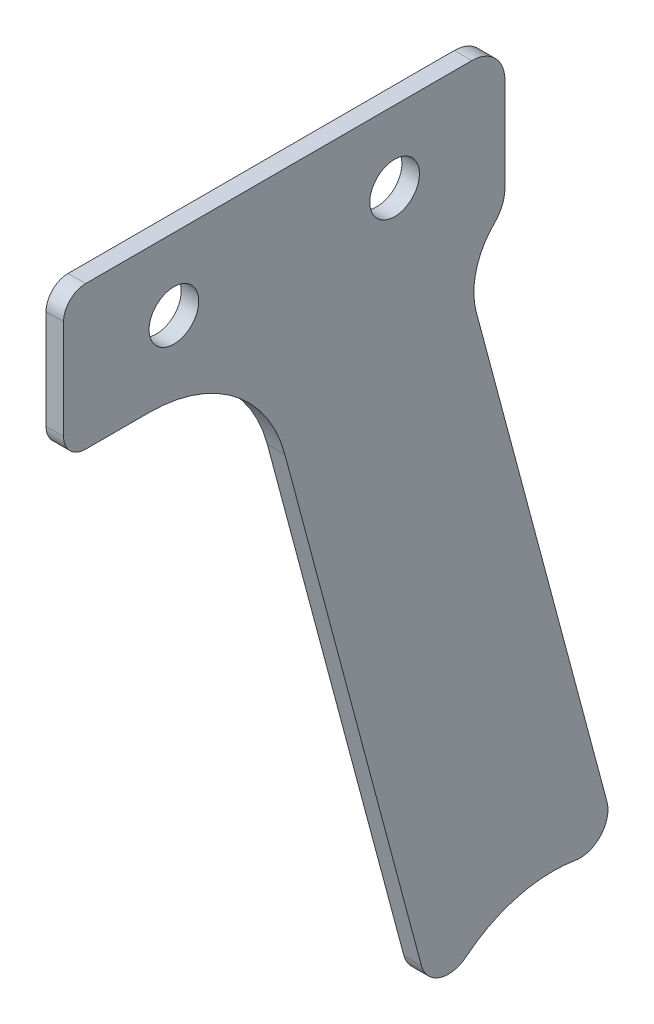
ISO-10303-21;
HEADER;
FILE_DESCRIPTION(('STEP AP214'),'2;1');
FILE_NAME('part.step','',(''),(''),'','','');
FILE_SCHEMA(('AUTOMOTIVE_DESIGN { 1 0 10303 214 1 1 1 1 }'));
ENDSEC;
DATA;
#1=APPLICATION_CONTEXT('core data for automotive mechanical design processes');
#2=APPLICATION_PROTOCOL_DEFINITION('international standard','automotive_design',2000,#1);
#3=PRODUCT_CONTEXT('',#1,'mechanical');
#4=PRODUCT('Part','Part','',(#3));
#5=PRODUCT_RELATED_PRODUCT_CATEGORY('part','',(#4));
#6=PRODUCT_DEFINITION_FORMATION('','',#4);
#7=PRODUCT_DEFINITION_CONTEXT('part definition',#1,'design');
#8=PRODUCT_DEFINITION('design','',#6,#7);
#9=PRODUCT_DEFINITION_SHAPE('','',#8);
#10=(LENGTH_UNIT() NAMED_UNIT(*) SI_UNIT(.MILLI.,.METRE.));
#11=(NAMED_UNIT(*) PLANE_ANGLE_UNIT() SI_UNIT($,.RADIAN.));
#12=(NAMED_UNIT(*) SI_UNIT($,.STERADIAN.) SOLID_ANGLE_UNIT());
#13=UNCERTAINTY_MEASURE_WITH_UNIT(LENGTH_MEASURE(1.E-05),#10,'distance_accuracy_value','');
#14=(GEOMETRIC_REPRESENTATION_CONTEXT(3) GLOBAL_UNCERTAINTY_ASSIGNED_CONTEXT((#13)) GLOBAL_UNIT_ASSIGNED_CONTEXT((#10,
#11,#12)) REPRESENTATION_CONTEXT('',''));
#15=CARTESIAN_POINT('',(0.,0.,0.));
#16=DIRECTION('',(0.,0.,1.));
#17=DIRECTION('',(1.,0.,0.));
#18=AXIS2_PLACEMENT_3D('',#15,#16,#17);
#19=CARTESIAN_POINT('',(-1.5875,247.591344708746,-926.969880761367));
#20=DIRECTION('',(0.,0.258051243760172,-0.966131231041533));
#21=DIRECTION('',(0.,0.966131231041533,0.258051243760172));
#22=AXIS2_PLACEMENT_3D('',#19,#20,#21);
#23=PLANE('',#22);
#24=DIRECTION('',(0.,0.966131231041533,0.258051243760172));
#25=VECTOR('',#24,1.);
#26=CARTESIAN_POINT('',(0.,247.591344708746,-926.969880761367));
#27=LINE('',#26,#25);
#28=CARTESIAN_POINT('',(0.,488.370245552131,-862.658436479766));
#29=VERTEX_POINT('',#28);
#30=CARTESIAN_POINT('',(0.,534.709690567615,-850.281286215706));
#31=VERTEX_POINT('',#30);
#32=EDGE_CURVE('E180',#29,#31,#27,.T.);
#33=ORIENTED_EDGE('',*,*,#32,.T.);
#34=DIRECTION('',(1.,0.,0.));
#35=VECTOR('',#34,1.);
#36=CARTESIAN_POINT('',(-1.5875,534.709690567615,-850.281286215706));
#37=LINE('',#36,#35);
#38=CARTESIAN_POINT('',(-1.5875,534.709690567615,-850.281286215706));
#39=VERTEX_POINT('',#38);
#40=EDGE_CURVE('E252',#31,#39,#37,.F.);
#41=ORIENTED_EDGE('',*,*,#40,.T.);
#42=DIRECTION('',(0.,0.966131231041533,0.258051243760172));
#43=VECTOR('',#42,1.);
#44=CARTESIAN_POINT('',(-1.5875,247.591344708746,-926.969880761367));
#45=LINE('',#44,#43);
#46=CARTESIAN_POINT('',(-1.5875,488.370245552131,-862.658436479766));
#47=VERTEX_POINT('',#46);
#48=EDGE_CURVE('E198',#47,#39,#45,.T.);
#49=ORIENTED_EDGE('',*,*,#48,.F.);
#50=DIRECTION('',(-1.,0.,0.));
#51=VECTOR('',#50,1.);
#52=CARTESIAN_POINT('',(0.,488.370245552131,-862.658436479766));
#53=LINE('',#52,#51);
#54=EDGE_CURVE('E239',#47,#29,#53,.F.);
#55=ORIENTED_EDGE('',*,*,#54,.T.);
#56=EDGE_LOOP('',(#33,#41,#49,#55));
#57=FACE_BOUND('',#56,.T.);
#58=ADVANCED_FACE('F41',(#57),#23,.F.);
#59=CARTESIAN_POINT('',(-1.5875,544.132439771861,0.));
#60=DIRECTION('',(0.,-1.,0.));
#61=DIRECTION('',(0.,0.,-1.));
#62=AXIS2_PLACEMENT_3D('',#59,#60,#61);
#63=PLANE('',#62);
#64=DIRECTION('',(0.,0.,-1.));
#65=VECTOR('',#64,1.);
#66=CARTESIAN_POINT('',(-1.5875,544.132439771861,0.));
#67=LINE('',#66,#65);
#68=CARTESIAN_POINT('',(-1.5875,544.132439771861,-832.226267654692));
#69=VERTEX_POINT('',#68);
#70=CARTESIAN_POINT('',(-1.5875,544.132439771861,-838.011419581479));
#71=VERTEX_POINT('',#70);
#72=EDGE_CURVE('E161',#69,#71,#67,.T.);
#73=ORIENTED_EDGE('',*,*,#72,.T.);
#74=DIRECTION('',(1.,0.,0.));
#75=VECTOR('',#74,1.);
#76=CARTESIAN_POINT('',(-1.5875,544.132439771861,-838.011419581479));
#77=LINE('',#76,#75);
#78=CARTESIAN_POINT('',(0.,544.132439771861,-838.011419581479));
#79=VERTEX_POINT('',#78);
#80=EDGE_CURVE('E249',#71,#79,#77,.T.);
#81=ORIENTED_EDGE('',*,*,#80,.T.);
#82=DIRECTION('',(0.,0.,-1.));
#83=VECTOR('',#82,1.);
#84=CARTESIAN_POINT('',(0.,544.132439771861,0.));
#85=LINE('',#84,#83);
#86=CARTESIAN_POINT('',(0.,544.132439771861,-832.226267654692));
#87=VERTEX_POINT('',#86);
#88=EDGE_CURVE('E195',#87,#79,#85,.T.);
#89=ORIENTED_EDGE('',*,*,#88,.F.);
#90=DIRECTION('',(1.,0.,0.));
#91=VECTOR('',#90,1.);
#92=CARTESIAN_POINT('',(-1.5875,544.132439771861,-832.226267654692));
#93=LINE('',#92,#91);
#94=EDGE_CURVE('E213',#69,#87,#93,.T.);
#95=ORIENTED_EDGE('',*,*,#94,.F.);
#96=EDGE_LOOP('',(#73,#81,#89,#95));
#97=FACE_BOUND('',#96,.T.);
#98=ADVANCED_FACE('F286',(#97),#63,.T.);
#99=CARTESIAN_POINT('',(-1.5875,546.132439771861,-832.226267654692));
#100=DIRECTION('',(1.,0.,0.));
#101=DIRECTION('',(0.,0.,-1.));
#102=AXIS2_PLACEMENT_3D('',#99,#100,#101);
#103=CYLINDRICAL_SURFACE('',#102,2.);
#104=CARTESIAN_POINT('',(0.,546.132439771861,-832.226267654692));
#105=DIRECTION('',(1.,0.,0.));
#106=DIRECTION('',(0.,0.,-1.));
#107=AXIS2_PLACEMENT_3D('',#104,#105,#106);
#108=CIRCLE('',#107,2.);
#109=CARTESIAN_POINT('',(0.,546.132439771861,-830.226267654692));
#110=VERTEX_POINT('',#109);
#111=EDGE_CURVE('E199',#110,#87,#108,.T.);
#112=ORIENTED_EDGE('',*,*,#111,.F.);
#113=DIRECTION('',(1.,0.,0.));
#114=VECTOR('',#113,1.);
#115=CARTESIAN_POINT('',(-1.5875,546.132439771861,-830.226267654692));
#116=LINE('',#115,#114);
#117=CARTESIAN_POINT('',(-1.5875,546.132439771861,-830.226267654692));
#118=VERTEX_POINT('',#117);
#119=EDGE_CURVE('E216',#118,#110,#116,.T.);
#120=ORIENTED_EDGE('',*,*,#119,.F.);
#121=CARTESIAN_POINT('',(-1.5875,546.132439771861,-832.226267654692));
#122=DIRECTION('',(1.,0.,0.));
#123=DIRECTION('',(0.,0.,-1.));
#124=AXIS2_PLACEMENT_3D('',#121,#122,#123);
#125=CIRCLE('',#124,2.);
#126=EDGE_CURVE('E177',#118,#69,#125,.T.);
#127=ORIENTED_EDGE('',*,*,#126,.T.);
#128=ORIENTED_EDGE('',*,*,#94,.T.);
#129=EDGE_LOOP('',(#112,#120,#127,#128));
#130=FACE_BOUND('',#129,.T.);
#131=ADVANCED_FACE('F346',(#130),#103,.T.);
#132=CARTESIAN_POINT('',(-1.5875,0.,-830.226267654692));
#133=DIRECTION('',(0.,0.,-1.));
#134=DIRECTION('',(-1.,0.,0.));
#135=AXIS2_PLACEMENT_3D('',#132,#133,#134);
#136=PLANE('',#135);
#137=DIRECTION('',(0.,1.,0.));
#138=VECTOR('',#137,1.);
#139=CARTESIAN_POINT('',(0.,0.,-830.226267654692));
#140=LINE('',#139,#138);
#141=CARTESIAN_POINT('',(0.,555.132439771861,-830.226267654692));
#142=VERTEX_POINT('',#141);
#143=EDGE_CURVE('E208',#110,#142,#140,.T.);
#144=ORIENTED_EDGE('',*,*,#143,.T.);
#145=DIRECTION('',(1.,0.,0.));
#146=VECTOR('',#145,1.);
#147=CARTESIAN_POINT('',(-1.5875,555.132439771861,-830.226267654692));
#148=LINE('',#147,#146);
#149=CARTESIAN_POINT('',(-1.5875,555.132439771861,-830.226267654692));
#150=VERTEX_POINT('',#149);
#151=EDGE_CURVE('E218',#150,#142,#148,.T.);
#152=ORIENTED_EDGE('',*,*,#151,.F.);
#153=DIRECTION('',(0.,1.,0.));
#154=VECTOR('',#153,1.);
#155=CARTESIAN_POINT('',(-1.5875,0.,-830.226267654692));
#156=LINE('',#155,#154);
#157=EDGE_CURVE('E175',#118,#150,#156,.T.);
#158=ORIENTED_EDGE('',*,*,#157,.F.);
#159=ORIENTED_EDGE('',*,*,#119,.T.);
#160=EDGE_LOOP('',(#144,#152,#158,#159));
#161=FACE_BOUND('',#160,.T.);
#162=ADVANCED_FACE('F471',(#161),#136,.F.);
#163=CARTESIAN_POINT('',(-1.5875,555.132439771861,-832.226267654692));
#164=DIRECTION('',(1.,0.,0.));
#165=DIRECTION('',(0.,0.,-1.));
#166=AXIS2_PLACEMENT_3D('',#163,#164,#165);
#167=CYLINDRICAL_SURFACE('',#166,2.);
#168=CARTESIAN_POINT('',(0.,555.132439771861,-832.226267654692));
#169=DIRECTION('',(1.,0.,0.));
#170=DIRECTION('',(0.,0.,-1.));
#171=AXIS2_PLACEMENT_3D('',#168,#169,#170);
#172=CIRCLE('',#171,2.);
#173=CARTESIAN_POINT('',(0.,557.132439771861,-832.226267654692));
#174=VERTEX_POINT('',#173);
#175=EDGE_CURVE('E205',#174,#142,#172,.T.);
#176=ORIENTED_EDGE('',*,*,#175,.F.);
#177=DIRECTION('',(1.,0.,0.));
#178=VECTOR('',#177,1.);
#179=CARTESIAN_POINT('',(-1.5875,557.132439771861,-832.226267654692));
#180=LINE('',#179,#178);
#181=CARTESIAN_POINT('',(-1.5875,557.132439771861,-832.226267654692));
#182=VERTEX_POINT('',#181);
#183=EDGE_CURVE('E220',#182,#174,#180,.T.);
#184=ORIENTED_EDGE('',*,*,#183,.F.);
#185=CARTESIAN_POINT('',(-1.5875,555.132439771861,-832.226267654692));
#186=DIRECTION('',(1.,0.,0.));
#187=DIRECTION('',(0.,0.,-1.));
#188=AXIS2_PLACEMENT_3D('',#185,#186,#187);
#189=CIRCLE('',#188,2.);
#190=EDGE_CURVE('E169',#182,#150,#189,.T.);
#191=ORIENTED_EDGE('',*,*,#190,.T.);
#192=ORIENTED_EDGE('',*,*,#151,.T.);
#193=EDGE_LOOP('',(#176,#184,#191,#192));
#194=FACE_BOUND('',#193,.T.);
#195=ADVANCED_FACE('F461',(#194),#167,.T.);
#196=CARTESIAN_POINT('',(-1.5875,557.132439771861,0.));
#197=DIRECTION('',(0.,-1.,0.));
#198=DIRECTION('',(0.,0.,-1.));
#199=AXIS2_PLACEMENT_3D('',#196,#197,#198);
#200=PLANE('',#199);
#201=DIRECTION('',(0.,0.,-1.));
#202=VECTOR('',#201,1.);
#203=CARTESIAN_POINT('',(0.,557.132439771861,0.));
#204=LINE('',#203,#202);
#205=CARTESIAN_POINT('',(0.,557.132439771861,-867.226267654692));
#206=VERTEX_POINT('',#205);
#207=EDGE_CURVE('E202',#174,#206,#204,.T.);
#208=ORIENTED_EDGE('',*,*,#207,.T.);
#209=DIRECTION('',(1.,0.,0.));
#210=VECTOR('',#209,1.);
#211=CARTESIAN_POINT('',(-1.5875,557.132439771861,-867.226267654692));
#212=LINE('',#211,#210);
#213=CARTESIAN_POINT('',(-1.5875,557.132439771861,-867.226267654692));
#214=VERTEX_POINT('',#213);
#215=EDGE_CURVE('E160',#214,#206,#212,.T.);
#216=ORIENTED_EDGE('',*,*,#215,.F.);
#217=DIRECTION('',(0.,0.,-1.));
#218=VECTOR('',#217,1.);
#219=CARTESIAN_POINT('',(-1.5875,557.132439771861,0.));
#220=LINE('',#219,#218);
#221=EDGE_CURVE('E166',#182,#214,#220,.T.);
#222=ORIENTED_EDGE('',*,*,#221,.F.);
#223=ORIENTED_EDGE('',*,*,#183,.T.);
#224=EDGE_LOOP('',(#208,#216,#222,#223));
#225=FACE_BOUND('',#224,.T.);
#226=ADVANCED_FACE('F452',(#225),#200,.F.);
#227=CARTESIAN_POINT('',(-1.5875,554.132439771861,-867.226267654692));
#228=DIRECTION('',(1.,0.,0.));
#229=DIRECTION('',(0.,0.,-1.));
#230=AXIS2_PLACEMENT_3D('',#227,#228,#229);
#231=CYLINDRICAL_SURFACE('',#230,3.);
#232=CARTESIAN_POINT('',(0.,554.132439771861,-867.226267654692));
#233=DIRECTION('',(1.,0.,0.));
#234=DIRECTION('',(0.,0.,-1.));
#235=AXIS2_PLACEMENT_3D('',#232,#233,#234);
#236=CIRCLE('',#235,3.);
#237=CARTESIAN_POINT('',(0.,554.132439771861,-870.226267654692));
#238=VERTEX_POINT('',#237);
#239=EDGE_CURVE('E159',#238,#206,#236,.T.);
#240=ORIENTED_EDGE('',*,*,#239,.F.);
#241=DIRECTION('',(1.,0.,0.));
#242=VECTOR('',#241,1.);
#243=CARTESIAN_POINT('',(-1.5875,554.132439771861,-870.226267654692));
#244=LINE('',#243,#242);
#245=CARTESIAN_POINT('',(-1.5875,554.132439771861,-870.226267654692));
#246=VERTEX_POINT('',#245);
#247=EDGE_CURVE('E147',#246,#238,#244,.T.);
#248=ORIENTED_EDGE('',*,*,#247,.F.);
#249=CARTESIAN_POINT('',(-1.5875,554.132439771861,-867.226267654692));
#250=DIRECTION('',(1.,0.,0.));
#251=DIRECTION('',(0.,0.,-1.));
#252=AXIS2_PLACEMENT_3D('',#249,#250,#251);
#253=CIRCLE('',#252,3.);
#254=EDGE_CURVE('E152',#246,#214,#253,.T.);
#255=ORIENTED_EDGE('',*,*,#254,.T.);
#256=ORIENTED_EDGE('',*,*,#215,.T.);
#257=EDGE_LOOP('',(#240,#248,#255,#256));
#258=FACE_BOUND('',#257,.T.);
#259=ADVANCED_FACE('F157',(#258),#231,.T.);
#260=CARTESIAN_POINT('',(-1.5875,9.66145238983859E-12,-870.226267654698));
#261=DIRECTION('',(0.,0.,-1.));
#262=DIRECTION('',(0.,1.,0.));
#263=AXIS2_PLACEMENT_3D('',#260,#261,#262);
#264=PLANE('',#263);
#265=DIRECTION('',(0.,1.,0.));
#266=VECTOR('',#265,1.);
#267=CARTESIAN_POINT('',(0.,9.66145238983859E-12,-870.226267654698));
#268=LINE('',#267,#266);
#269=CARTESIAN_POINT('',(0.,545.61844813898,-870.226267654692));
#270=VERTEX_POINT('',#269);
#271=EDGE_CURVE('E194',#270,#238,#268,.T.);
#272=ORIENTED_EDGE('',*,*,#271,.F.);
#273=DIRECTION('',(-1.,0.,0.));
#274=VECTOR('',#273,1.);
#275=CARTESIAN_POINT('',(-1.5875,545.61844813898,-870.226267654692));
#276=LINE('',#275,#274);
#277=CARTESIAN_POINT('',(-1.5875,545.61844813898,-870.226267654692));
#278=VERTEX_POINT('',#277);
#279=EDGE_CURVE('E49',#270,#278,#276,.T.);
#280=ORIENTED_EDGE('',*,*,#279,.T.);
#281=DIRECTION('',(0.,1.,0.));
#282=VECTOR('',#281,1.);
#283=CARTESIAN_POINT('',(-1.5875,9.66145238983859E-12,-870.226267654698));
#284=LINE('',#283,#282);
#285=EDGE_CURVE('E144',#278,#246,#284,.T.);
#286=ORIENTED_EDGE('',*,*,#285,.T.);
#287=ORIENTED_EDGE('',*,*,#247,.T.);
#288=EDGE_LOOP('',(#272,#280,#286,#287));
#289=FACE_BOUND('',#288,.T.);
#290=ADVANCED_FACE('F146',(#289),#264,.T.);
#291=CARTESIAN_POINT('',(-1.5875,252.082031136414,-943.782791032079));
#292=DIRECTION('',(0.,-0.258051243760172,0.966131231041533));
#293=DIRECTION('',(0.,-0.966131231041533,-0.258051243760171));
#294=AXIS2_PLACEMENT_3D('',#291,#292,#293);
#295=PLANE('',#294);
#296=DIRECTION('',(0.,-0.966131231041533,-0.258051243760172));
#297=VECTOR('',#296,1.);
#298=CARTESIAN_POINT('',(-1.5875,252.082031136414,-943.782791032079));
#299=LINE('',#298,#297);
#300=CARTESIAN_POINT('',(-1.5875,537.217132969926,-867.623916022419));
#301=VERTEX_POINT('',#300);
#302=CARTESIAN_POINT('',(-1.5875,492.831430693317,-879.479226470565));
#303=VERTEX_POINT('',#302);
#304=EDGE_CURVE('E153',#301,#303,#299,.T.);
#305=ORIENTED_EDGE('',*,*,#304,.F.);
#306=DIRECTION('',(1.,0.,0.));
#307=VECTOR('',#306,1.);
#308=CARTESIAN_POINT('',(-1.5875,537.217132969926,-867.623916022419));
#309=LINE('',#308,#307);
#310=CARTESIAN_POINT('',(0.,537.217132969926,-867.623916022419));
#311=VERTEX_POINT('',#310);
#312=EDGE_CURVE('E242',#301,#311,#309,.T.);
#313=ORIENTED_EDGE('',*,*,#312,.T.);
#314=DIRECTION('',(0.,-0.966131231041533,-0.258051243760172));
#315=VECTOR('',#314,1.);
#316=CARTESIAN_POINT('',(0.,252.082031136414,-943.782791032079));
#317=LINE('',#316,#315);
#318=CARTESIAN_POINT('',(0.,492.831430693317,-879.479226470565));
#319=VERTEX_POINT('',#318);
#320=EDGE_CURVE('E189',#311,#319,#317,.T.);
#321=ORIENTED_EDGE('',*,*,#320,.T.);
#322=DIRECTION('',(-1.,0.,0.));
#323=VECTOR('',#322,1.);
#324=CARTESIAN_POINT('',(-1.5875,492.831430693317,-879.479226470565));
#325=LINE('',#324,#323);
#326=EDGE_CURVE('E232',#319,#303,#325,.T.);
#327=ORIENTED_EDGE('',*,*,#326,.T.);
#328=EDGE_LOOP('',(#305,#313,#321,#327));
#329=FACE_BOUND('',#328,.T.);
#330=ADVANCED_FACE('F272',(#329),#295,.F.);
#331=CARTESIAN_POINT('',(-1.5875,489.202974707188,-870.624756009542));
#332=CARTESIAN_POINT('',(-1.5875,497.235159963985,-894.721311780076));
#333=CARTESIAN_POINT('',(-1.5875,472.552405882785,-902.948896473761));
#334=CARTESIAN_POINT('',(-1.5875,464.520220625987,-878.852340703227));
#335=CARTESIAN_POINT('',(-1.5875,456.488035369189,-854.755784932694));
#336=CARTESIAN_POINT('',(-1.5875,481.17078945039,-846.528200239009));
#337=CARTESIAN_POINT('',(-1.5875,489.202974707188,-870.624756009542));
#338=(BOUNDED_CURVE() B_SPLINE_CURVE(3,(#331,#332,#333,#334,#335,#336,#337),.UNSPECIFIED.,.T.,
.F.) B_SPLINE_CURVE_WITH_KNOTS((4,3,4),(0.,0.5,1.),
.UNSPECIFIED.) CURVE() GEOMETRIC_REPRESENTATION_ITEM() RATIONAL_B_SPLINE_CURVE((1.,
0.333333333333333,0.333333333333333,1.,0.333333333333333,0.333333333333333,1.)) REPRESENTATION_ITEM(''));
#339=DIRECTION('',(1.,0.,0.));
#340=VECTOR('',#339,1.);
#341=SURFACE_OF_LINEAR_EXTRUSION('',#338,#340);
#342=CARTESIAN_POINT('',(-1.5875,487.054636708806,-866.714448011136));
#343=VERTEX_POINT('',#342);
#344=CARTESIAN_POINT('',(-1.5875,489.670311539135,-876.609052606315));
#345=VERTEX_POINT('',#344);
#346=EDGE_CURVE('E274',#343,#345,#338,.T.);
#347=ORIENTED_EDGE('',*,*,#346,.T.);
#348=DIRECTION('',(1.,0.,0.));
#349=VECTOR('',#348,1.);
#350=CARTESIAN_POINT('',(-1.5875,489.670311539135,-876.609052606315));
#351=LINE('',#350,#349);
#352=CARTESIAN_POINT('',(0.,489.670311539135,-876.609052606315));
#353=VERTEX_POINT('',#352);
#354=EDGE_CURVE('E224',#345,#353,#351,.T.);
#355=ORIENTED_EDGE('',*,*,#354,.T.);
#356=CARTESIAN_POINT('',(0.,489.202974707188,-870.624756009542));
#357=CARTESIAN_POINT('',(0.,497.235159963985,-894.721311780076));
#358=CARTESIAN_POINT('',(0.,472.552405882785,-902.948896473761));
#359=CARTESIAN_POINT('',(0.,464.520220625987,-878.852340703227));
#360=CARTESIAN_POINT('',(0.,456.488035369189,-854.755784932694));
#361=CARTESIAN_POINT('',(0.,481.17078945039,-846.528200239009));
#362=CARTESIAN_POINT('',(0.,489.202974707188,-870.624756009542));
#363=(BOUNDED_CURVE() B_SPLINE_CURVE(3,(#356,#357,#358,#359,#360,#361,#362),.UNSPECIFIED.,.T.,
.F.) B_SPLINE_CURVE_WITH_KNOTS((4,3,4),(0.,0.5,1.),
.UNSPECIFIED.) CURVE() GEOMETRIC_REPRESENTATION_ITEM() RATIONAL_B_SPLINE_CURVE((1.,
0.333333333333333,0.333333333333333,1.,0.333333333333333,0.333333333333333,1.)) REPRESENTATION_ITEM(''));
#364=CARTESIAN_POINT('',(0.,487.054636708806,-866.714448011136));
#365=VERTEX_POINT('',#364);
#366=EDGE_CURVE('E183',#365,#353,#363,.T.);
#367=ORIENTED_EDGE('',*,*,#366,.F.);
#368=DIRECTION('',(1.,0.,0.));
#369=VECTOR('',#368,1.);
#370=CARTESIAN_POINT('',(0.,487.054636708805,-866.714448011135));
#371=LINE('',#370,#369);
#372=EDGE_CURVE('E215',#365,#343,#371,.F.);
#373=ORIENTED_EDGE('',*,*,#372,.T.);
#374=EDGE_LOOP('',(#347,#355,#367,#373));
#375=FACE_BOUND('',#374,.T.);
#376=ADVANCED_FACE('F304',(#375),#341,.T.);
#377=CARTESIAN_POINT('',(-1.5875,0.,0.));
#378=DIRECTION('',(1.,0.,0.));
#379=DIRECTION('',(0.,0.,-1.));
#380=AXIS2_PLACEMENT_3D('',#377,#378,#379);
#381=PLANE('',#380);
#382=CARTESIAN_POINT('',(-1.5875,550.632439771863,-860.22626765469));
#383=DIRECTION('',(-1.,0.,0.));
#384=DIRECTION('',(0.,0.,1.));
#385=AXIS2_PLACEMENT_3D('',#382,#383,#384);
#386=CIRCLE('',#385,2.24999999999997);
#387=CARTESIAN_POINT('',(-1.5875,550.632439771863,-857.97626765469));
#388=VERTEX_POINT('',#387);
#389=EDGE_CURVE('E318',#388,#388,#386,.T.);
#390=ORIENTED_EDGE('',*,*,#389,.F.);
#391=EDGE_LOOP('',(#390));
#392=FACE_BOUND('',#391,.T.);
#393=CARTESIAN_POINT('',(-1.5875,550.632439771863,-840.22626765469));
#394=DIRECTION('',(-1.,0.,0.));
#395=DIRECTION('',(0.,0.,1.));
#396=AXIS2_PLACEMENT_3D('',#393,#394,#395);
#397=CIRCLE('',#396,2.24999999999997);
#398=CARTESIAN_POINT('',(-1.5875,550.632439771863,-837.97626765469));
#399=VERTEX_POINT('',#398);
#400=EDGE_CURVE('E312',#399,#399,#397,.T.);
#401=ORIENTED_EDGE('',*,*,#400,.F.);
#402=EDGE_LOOP('',(#401));
#403=FACE_BOUND('',#402,.T.);
#404=ORIENTED_EDGE('',*,*,#285,.F.);
#405=CARTESIAN_POINT('',(-1.5875,545.61844813898,-867.051267654692));
#406=DIRECTION('',(1.,0.,0.));
#407=DIRECTION('',(0.,0.,-1.));
#408=AXIS2_PLACEMENT_3D('',#405,#406,#407);
#409=CIRCLE('',#408,3.175);
#410=CARTESIAN_POINT('',(-1.5875,543.364218215255,-869.287128216305));
#411=VERTEX_POINT('',#410);
#412=EDGE_CURVE('E11',#278,#411,#409,.F.);
#413=ORIENTED_EDGE('',*,*,#412,.T.);
#414=CARTESIAN_POINT('',(-1.5875,538.855758367803,-873.758849339533));
#415=DIRECTION('',(1.,0.,0.));
#416=DIRECTION('',(0.,0.,-1.));
#417=AXIS2_PLACEMENT_3D('',#414,#415,#416);
#418=CIRCLE('',#417,6.35);
#419=EDGE_CURVE('E247',#411,#301,#418,.T.);
#420=ORIENTED_EDGE('',*,*,#419,.T.);
#421=ORIENTED_EDGE('',*,*,#304,.T.);
#422=CARTESIAN_POINT('',(-1.5875,492.175980534166,-877.02525314372));
#423=DIRECTION('',(1.,0.,0.));
#424=DIRECTION('',(0.,0.,-1.));
#425=AXIS2_PLACEMENT_3D('',#422,#423,#424);
#426=CIRCLE('',#425,2.54);
#427=EDGE_CURVE('E237',#303,#345,#426,.F.);
#428=ORIENTED_EDGE('',*,*,#427,.T.);
#429=ORIENTED_EDGE('',*,*,#346,.F.);
#430=CARTESIAN_POINT('',(-1.5875,489.025695711282,-865.112409806611));
#431=DIRECTION('',(1.,0.,0.));
#432=DIRECTION('',(0.,0.,-1.));
#433=AXIS2_PLACEMENT_3D('',#430,#431,#432);
#434=CIRCLE('',#433,2.54);
#435=EDGE_CURVE('E235',#343,#47,#434,.F.);
#436=ORIENTED_EDGE('',*,*,#435,.T.);
#437=ORIENTED_EDGE('',*,*,#48,.T.);
#438=CARTESIAN_POINT('',(-1.5875,531.43243977186,-838.011419581479));
#439=DIRECTION('',(1.,0.,0.));
#440=DIRECTION('',(0.,0.,-1.));
#441=AXIS2_PLACEMENT_3D('',#438,#439,#440);
#442=CIRCLE('',#441,12.7);
#443=EDGE_CURVE('E256',#39,#71,#442,.T.);
#444=ORIENTED_EDGE('',*,*,#443,.T.);
#445=ORIENTED_EDGE('',*,*,#72,.F.);
#446=ORIENTED_EDGE('',*,*,#126,.F.);
#447=ORIENTED_EDGE('',*,*,#157,.T.);
#448=ORIENTED_EDGE('',*,*,#190,.F.);
#449=ORIENTED_EDGE('',*,*,#221,.T.);
#450=ORIENTED_EDGE('',*,*,#254,.F.);
#451=EDGE_LOOP('',(#404,#413,#420,#421,#428,#429,#436,#437,#444,#445,#446,#447,#448,#449,#450));
#452=FACE_BOUND('',#451,.T.);
#453=ADVANCED_FACE('F163',(#392,#403,#452),#381,.F.);
#454=CARTESIAN_POINT('',(0.,0.,0.));
#455=DIRECTION('',(1.,0.,0.));
#456=DIRECTION('',(0.,0.,-1.));
#457=AXIS2_PLACEMENT_3D('',#454,#455,#456);
#458=PLANE('',#457);
#459=CARTESIAN_POINT('',(0.,550.632439771863,-860.22626765469));
#460=DIRECTION('',(-1.,0.,0.));
#461=DIRECTION('',(0.,0.,1.));
#462=AXIS2_PLACEMENT_3D('',#459,#460,#461);
#463=CIRCLE('',#462,2.24999999999997);
#464=CARTESIAN_POINT('',(0.,550.632439771863,-857.97626765469));
#465=VERTEX_POINT('',#464);
#466=EDGE_CURVE('E315',#465,#465,#463,.T.);
#467=ORIENTED_EDGE('',*,*,#466,.T.);
#468=EDGE_LOOP('',(#467));
#469=FACE_BOUND('',#468,.T.);
#470=CARTESIAN_POINT('',(0.,550.632439771863,-840.22626765469));
#471=DIRECTION('',(-1.,0.,0.));
#472=DIRECTION('',(0.,0.,1.));
#473=AXIS2_PLACEMENT_3D('',#470,#471,#472);
#474=CIRCLE('',#473,2.24999999999997);
#475=CARTESIAN_POINT('',(0.,550.632439771863,-837.97626765469));
#476=VERTEX_POINT('',#475);
#477=EDGE_CURVE('E184',#476,#476,#474,.T.);
#478=ORIENTED_EDGE('',*,*,#477,.T.);
#479=EDGE_LOOP('',(#478));
#480=FACE_BOUND('',#479,.T.);
#481=CARTESIAN_POINT('',(0.,538.855758367803,-873.758849339533));
#482=DIRECTION('',(1.,0.,0.));
#483=DIRECTION('',(0.,0.,-1.));
#484=AXIS2_PLACEMENT_3D('',#481,#482,#483);
#485=CIRCLE('',#484,6.35);
#486=CARTESIAN_POINT('',(0.,543.364218215255,-869.287128216305));
#487=VERTEX_POINT('',#486);
#488=EDGE_CURVE('E245',#311,#487,#485,.F.);
#489=ORIENTED_EDGE('',*,*,#488,.T.);
#490=CARTESIAN_POINT('',(0.,545.61844813898,-867.051267654692));
#491=DIRECTION('',(1.,0.,0.));
#492=DIRECTION('',(0.,0.,-1.));
#493=AXIS2_PLACEMENT_3D('',#490,#491,#492);
#494=CIRCLE('',#493,3.175);
#495=EDGE_CURVE('E63',#487,#270,#494,.T.);
#496=ORIENTED_EDGE('',*,*,#495,.T.);
#497=ORIENTED_EDGE('',*,*,#271,.T.);
#498=ORIENTED_EDGE('',*,*,#239,.T.);
#499=ORIENTED_EDGE('',*,*,#207,.F.);
#500=ORIENTED_EDGE('',*,*,#175,.T.);
#501=ORIENTED_EDGE('',*,*,#143,.F.);
#502=ORIENTED_EDGE('',*,*,#111,.T.);
#503=ORIENTED_EDGE('',*,*,#88,.T.);
#504=CARTESIAN_POINT('',(0.,531.43243977186,-838.011419581479));
#505=DIRECTION('',(1.,0.,0.));
#506=DIRECTION('',(0.,0.,-1.));
#507=AXIS2_PLACEMENT_3D('',#504,#505,#506);
#508=CIRCLE('',#507,12.7);
#509=EDGE_CURVE('E254',#79,#31,#508,.F.);
#510=ORIENTED_EDGE('',*,*,#509,.T.);
#511=ORIENTED_EDGE('',*,*,#32,.F.);
#512=CARTESIAN_POINT('',(0.,489.025695711282,-865.112409806611));
#513=DIRECTION('',(1.,0.,0.));
#514=DIRECTION('',(0.,0.,-1.));
#515=AXIS2_PLACEMENT_3D('',#512,#513,#514);
#516=CIRCLE('',#515,2.54);
#517=EDGE_CURVE('E227',#29,#365,#516,.T.);
#518=ORIENTED_EDGE('',*,*,#517,.T.);
#519=ORIENTED_EDGE('',*,*,#366,.T.);
#520=CARTESIAN_POINT('',(0.,492.175980534166,-877.02525314372));
#521=DIRECTION('',(1.,0.,0.));
#522=DIRECTION('',(0.,0.,-1.));
#523=AXIS2_PLACEMENT_3D('',#520,#521,#522);
#524=CIRCLE('',#523,2.54);
#525=EDGE_CURVE('E229',#353,#319,#524,.T.);
#526=ORIENTED_EDGE('',*,*,#525,.T.);
#527=ORIENTED_EDGE('',*,*,#320,.F.);
#528=EDGE_LOOP('',(#489,#496,#497,#498,#499,#500,#501,#502,#503,#510,#511,#518,#519,#526,#527));
#529=FACE_BOUND('',#528,.T.);
#530=ADVANCED_FACE('F268',(#469,#480,#529),#458,.T.);
#531=CARTESIAN_POINT('',(-0.79375,492.175980534166,-877.02525314372));
#532=DIRECTION('',(1.,0.,0.));
#533=DIRECTION('',(0.,0.,-1.));
#534=AXIS2_PLACEMENT_3D('',#531,#532,#533);
#535=CYLINDRICAL_SURFACE('',#534,2.54);
#536=ORIENTED_EDGE('',*,*,#427,.F.);
#537=ORIENTED_EDGE('',*,*,#326,.F.);
#538=ORIENTED_EDGE('',*,*,#525,.F.);
#539=ORIENTED_EDGE('',*,*,#354,.F.);
#540=EDGE_LOOP('',(#536,#537,#538,#539));
#541=FACE_BOUND('',#540,.T.);
#542=ADVANCED_FACE('F308',(#541),#535,.T.);
#543=CARTESIAN_POINT('',(-0.79375,489.025695711282,-865.112409806611));
#544=DIRECTION('',(1.,0.,0.));
#545=DIRECTION('',(0.,0.,-1.));
#546=AXIS2_PLACEMENT_3D('',#543,#544,#545);
#547=CYLINDRICAL_SURFACE('',#546,2.54);
#548=ORIENTED_EDGE('',*,*,#435,.F.);
#549=ORIENTED_EDGE('',*,*,#372,.F.);
#550=ORIENTED_EDGE('',*,*,#517,.F.);
#551=ORIENTED_EDGE('',*,*,#54,.F.);
#552=EDGE_LOOP('',(#548,#549,#550,#551));
#553=FACE_BOUND('',#552,.T.);
#554=ADVANCED_FACE('F300',(#553),#547,.T.);
#555=CARTESIAN_POINT('',(-1.5875,550.632439771863,-840.22626765469));
#556=DIRECTION('',(-1.,0.,0.));
#557=DIRECTION('',(0.,0.,1.));
#558=AXIS2_PLACEMENT_3D('',#555,#556,#557);
#559=CYLINDRICAL_SURFACE('',#558,2.24999999999997);
#560=ORIENTED_EDGE('',*,*,#477,.F.);
#561=EDGE_LOOP('',(#560));
#562=FACE_BOUND('',#561,.T.);
#563=ORIENTED_EDGE('',*,*,#400,.T.);
#564=EDGE_LOOP('',(#563));
#565=FACE_BOUND('',#564,.T.);
#566=ADVANCED_FACE('F329',(#562,#565),#559,.F.);
#567=CARTESIAN_POINT('',(-1.5875,550.632439771863,-860.22626765469));
#568=DIRECTION('',(-1.,0.,0.));
#569=DIRECTION('',(0.,0.,1.));
#570=AXIS2_PLACEMENT_3D('',#567,#568,#569);
#571=CYLINDRICAL_SURFACE('',#570,2.24999999999997);
#572=ORIENTED_EDGE('',*,*,#466,.F.);
#573=EDGE_LOOP('',(#572));
#574=FACE_BOUND('',#573,.T.);
#575=ORIENTED_EDGE('',*,*,#389,.T.);
#576=EDGE_LOOP('',(#575));
#577=FACE_BOUND('',#576,.T.);
#578=ADVANCED_FACE('F322',(#574,#577),#571,.F.);
#579=CARTESIAN_POINT('',(-1.5875,538.855758367803,-873.758849339533));
#580=DIRECTION('',(1.,0.,0.));
#581=DIRECTION('',(0.,0.,-1.));
#582=AXIS2_PLACEMENT_3D('',#579,#580,#581);
#583=CYLINDRICAL_SURFACE('',#582,6.35);
#584=ORIENTED_EDGE('',*,*,#419,.F.);
#585=DIRECTION('',(1.,0.,0.));
#586=VECTOR('',#585,1.);
#587=CARTESIAN_POINT('',(-1.5875,543.364218215255,-869.287128216305));
#588=LINE('',#587,#586);
#589=EDGE_CURVE('E258',#411,#487,#588,.T.);
#590=ORIENTED_EDGE('',*,*,#589,.T.);
#591=ORIENTED_EDGE('',*,*,#488,.F.);
#592=ORIENTED_EDGE('',*,*,#312,.F.);
#593=EDGE_LOOP('',(#584,#590,#591,#592));
#594=FACE_BOUND('',#593,.T.);
#595=ADVANCED_FACE('F264',(#594),#583,.F.);
#596=CARTESIAN_POINT('',(-1.5875,531.43243977186,-838.011419581479));
#597=DIRECTION('',(1.,0.,0.));
#598=DIRECTION('',(0.,0.,-1.));
#599=AXIS2_PLACEMENT_3D('',#596,#597,#598);
#600=CYLINDRICAL_SURFACE('',#599,12.7);
#601=ORIENTED_EDGE('',*,*,#443,.F.);
#602=ORIENTED_EDGE('',*,*,#40,.F.);
#603=ORIENTED_EDGE('',*,*,#509,.F.);
#604=ORIENTED_EDGE('',*,*,#80,.F.);
#605=EDGE_LOOP('',(#601,#602,#603,#604));
#606=FACE_BOUND('',#605,.T.);
#607=ADVANCED_FACE('F291',(#606),#600,.F.);
#608=CARTESIAN_POINT('',(-1.5875,545.61844813898,-867.051267654692));
#609=DIRECTION('',(1.,0.,0.));
#610=DIRECTION('',(0.,0.,-1.));
#611=AXIS2_PLACEMENT_3D('',#608,#609,#610);
#612=CYLINDRICAL_SURFACE('',#611,3.175);
#613=ORIENTED_EDGE('',*,*,#412,.F.);
#614=ORIENTED_EDGE('',*,*,#279,.F.);
#615=ORIENTED_EDGE('',*,*,#495,.F.);
#616=ORIENTED_EDGE('',*,*,#589,.F.);
#617=EDGE_LOOP('',(#613,#614,#615,#616));
#618=FACE_BOUND('',#617,.T.);
#619=ADVANCED_FACE('F43',(#618),#612,.T.);
#620=CLOSED_SHELL('',(#58,#98,#131,#162,#195,#226,#259,#290,#330,#376,#453,#530,#542,#554,#566,
#578,#595,#607,#619));
#621=MANIFOLD_SOLID_BREP('B2',#620);
#622=ADVANCED_BREP_SHAPE_REPRESENTATION('',(#18,#621),#14);
#623=SHAPE_DEFINITION_REPRESENTATION(#9,#622);
ENDSEC;
END-ISO-10303-21;
